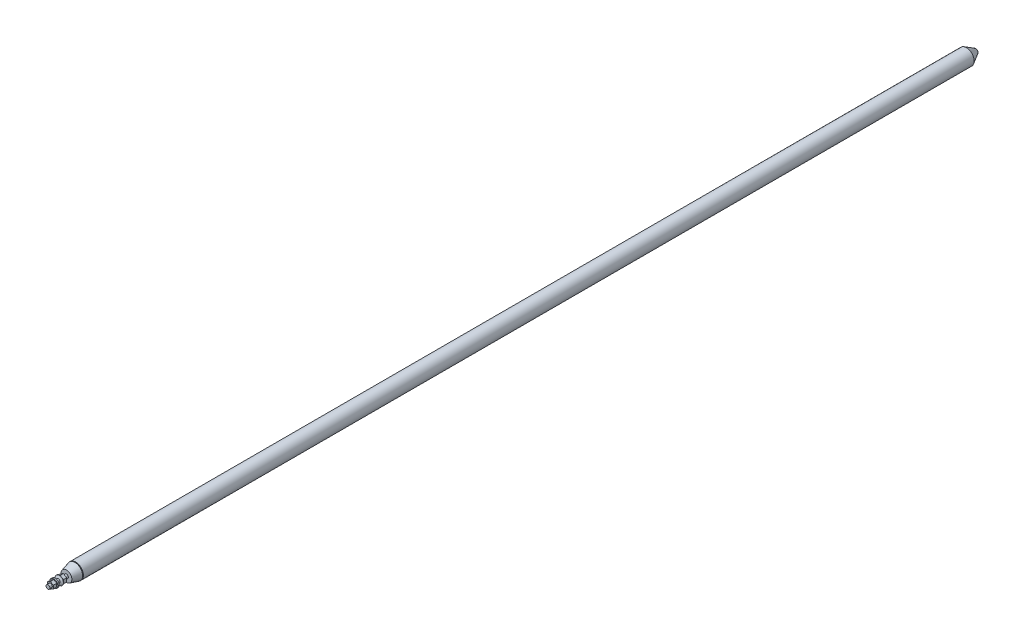
ISO-10303-21;
HEADER;
FILE_DESCRIPTION(('STEP AP214'),'2;1');
FILE_NAME('part.step','',(''),(''),'','','');
FILE_SCHEMA(('AUTOMOTIVE_DESIGN { 1 0 10303 214 1 1 1 1 }'));
ENDSEC;
DATA;
#1=APPLICATION_CONTEXT('core data for automotive mechanical design processes');
#2=APPLICATION_PROTOCOL_DEFINITION('international standard','automotive_design',2000,#1);
#3=PRODUCT_CONTEXT('',#1,'mechanical');
#4=PRODUCT('Part','Part','',(#3));
#5=PRODUCT_RELATED_PRODUCT_CATEGORY('part','',(#4));
#6=PRODUCT_DEFINITION_FORMATION('','',#4);
#7=PRODUCT_DEFINITION_CONTEXT('part definition',#1,'design');
#8=PRODUCT_DEFINITION('design','',#6,#7);
#9=PRODUCT_DEFINITION_SHAPE('','',#8);
#10=(LENGTH_UNIT() NAMED_UNIT(*) SI_UNIT(.MILLI.,.METRE.));
#11=(NAMED_UNIT(*) PLANE_ANGLE_UNIT() SI_UNIT($,.RADIAN.));
#12=(NAMED_UNIT(*) SI_UNIT($,.STERADIAN.) SOLID_ANGLE_UNIT());
#13=UNCERTAINTY_MEASURE_WITH_UNIT(LENGTH_MEASURE(1.E-05),#10,'distance_accuracy_value','');
#14=(GEOMETRIC_REPRESENTATION_CONTEXT(3) GLOBAL_UNCERTAINTY_ASSIGNED_CONTEXT((#13)) GLOBAL_UNIT_ASSIGNED_CONTEXT((#10,
#11,#12)) REPRESENTATION_CONTEXT('',''));
#15=CARTESIAN_POINT('',(0.,0.,0.));
#16=DIRECTION('',(0.,0.,1.));
#17=DIRECTION('',(1.,0.,0.));
#18=AXIS2_PLACEMENT_3D('',#15,#16,#17);
#19=CARTESIAN_POINT('',(0.,16.6751,52.1089983991226));
#20=DIRECTION('',(0.,0.,1.));
#21=DIRECTION('',(1.,0.,0.));
#22=AXIS2_PLACEMENT_3D('',#19,#20,#21);
#23=PLANE('',#22);
#24=CARTESIAN_POINT('',(0.,0.,52.1089983991226));
#25=DIRECTION('',(0.,0.,-1.));
#26=DIRECTION('',(-1.,0.,0.));
#27=AXIS2_PLACEMENT_3D('',#24,#25,#26);
#28=CIRCLE('',#27,16.6751);
#29=CARTESIAN_POINT('',(-16.6751,0.,52.1089983991226));
#30=VERTEX_POINT('',#29);
#31=EDGE_CURVE('E149',#30,#30,#28,.T.);
#32=ORIENTED_EDGE('',*,*,#31,.F.);
#33=EDGE_LOOP('',(#32));
#34=FACE_BOUND('',#33,.T.);
#35=DIRECTION('',(0.866025403784438,0.5,0.));
#36=VECTOR('',#35,1.);
#37=CARTESIAN_POINT('',(0.,-13.7554856334967,52.1089983991226));
#38=LINE('',#37,#36);
#39=CARTESIAN_POINT('',(0.,-13.7554856334967,52.1089983991226));
#40=VERTEX_POINT('',#39);
#41=CARTESIAN_POINT('',(11.9126,-6.87774281674833,52.1089983991226));
#42=VERTEX_POINT('',#41);
#43=EDGE_CURVE('E626',#40,#42,#38,.T.);
#44=ORIENTED_EDGE('',*,*,#43,.F.);
#45=DIRECTION('',(0.866025403784439,-0.499999999999999,0.));
#46=VECTOR('',#45,1.);
#47=CARTESIAN_POINT('',(-11.9126,-6.87774281674834,52.1089983991226));
#48=LINE('',#47,#46);
#49=CARTESIAN_POINT('',(-11.9126,-6.87774281674834,52.1089983991226));
#50=VERTEX_POINT('',#49);
#51=EDGE_CURVE('E147',#50,#40,#48,.T.);
#52=ORIENTED_EDGE('',*,*,#51,.F.);
#53=DIRECTION('',(0.,-1.,0.));
#54=VECTOR('',#53,1.);
#55=CARTESIAN_POINT('',(-11.9126,6.87774281674833,52.1089983991226));
#56=LINE('',#55,#54);
#57=CARTESIAN_POINT('',(-11.9126,6.87774281674833,52.1089983991226));
#58=VERTEX_POINT('',#57);
#59=EDGE_CURVE('E143',#58,#50,#56,.T.);
#60=ORIENTED_EDGE('',*,*,#59,.F.);
#61=DIRECTION('',(-0.866025403784439,-0.5,0.));
#62=VECTOR('',#61,1.);
#63=CARTESIAN_POINT('',(0.,13.7554856334967,52.1089983991226));
#64=LINE('',#63,#62);
#65=CARTESIAN_POINT('',(0.,13.7554856334967,52.1089983991226));
#66=VERTEX_POINT('',#65);
#67=EDGE_CURVE('E622',#66,#58,#64,.T.);
#68=ORIENTED_EDGE('',*,*,#67,.F.);
#69=DIRECTION('',(-0.866025403784439,0.5,0.));
#70=VECTOR('',#69,1.);
#71=CARTESIAN_POINT('',(11.9126,6.87774281674833,52.1089983991226));
#72=LINE('',#71,#70);
#73=CARTESIAN_POINT('',(11.9126,6.87774281674833,52.1089983991226));
#74=VERTEX_POINT('',#73);
#75=EDGE_CURVE('E634',#74,#66,#72,.T.);
#76=ORIENTED_EDGE('',*,*,#75,.F.);
#77=DIRECTION('',(0.,1.,0.));
#78=VECTOR('',#77,1.);
#79=CARTESIAN_POINT('',(11.9126,-6.87774281674833,52.1089983991226));
#80=LINE('',#79,#78);
#81=EDGE_CURVE('E628',#42,#74,#80,.T.);
#82=ORIENTED_EDGE('',*,*,#81,.F.);
#83=EDGE_LOOP('',(#44,#52,#60,#68,#76,#82));
#84=FACE_BOUND('',#83,.T.);
#85=ADVANCED_FACE('F33',(#34,#84),#23,.T.);
#86=CARTESIAN_POINT('',(0.,0.,0.));
#87=DIRECTION('',(0.,0.,-1.));
#88=DIRECTION('',(-1.,0.,0.));
#89=AXIS2_PLACEMENT_3D('',#86,#87,#88);
#90=CYLINDRICAL_SURFACE('',#89,7.93749999999999);
#91=CARTESIAN_POINT('',(0.,0.,46.2923983991226));
#92=DIRECTION('',(0.,0.,-1.));
#93=DIRECTION('',(-1.,0.,0.));
#94=AXIS2_PLACEMENT_3D('',#91,#92,#93);
#95=CIRCLE('',#94,7.93749999999999);
#96=CARTESIAN_POINT('',(-7.93749999999999,0.,46.2923983991226));
#97=VERTEX_POINT('',#96);
#98=EDGE_CURVE('E42',#97,#97,#95,.F.);
#99=ORIENTED_EDGE('',*,*,#98,.F.);
#100=EDGE_LOOP('',(#99));
#101=FACE_BOUND('',#100,.T.);
#102=CARTESIAN_POINT('',(0.,0.,33.5923983991226));
#103=DIRECTION('',(0.,0.,-1.));
#104=DIRECTION('',(-1.,0.,0.));
#105=AXIS2_PLACEMENT_3D('',#102,#103,#104);
#106=CIRCLE('',#105,7.93749999999999);
#107=CARTESIAN_POINT('',(0.,7.93749999999996,33.5923983991227));
#108=VERTEX_POINT('',#107);
#109=EDGE_CURVE('E236',#108,#108,#106,.T.);
#110=ORIENTED_EDGE('',*,*,#109,.F.);
#111=EDGE_LOOP('',(#110));
#112=FACE_BOUND('',#111,.T.);
#113=ADVANCED_FACE('F248',(#101,#112),#90,.T.);
#114=CARTESIAN_POINT('',(0.,0.,0.));
#115=DIRECTION('',(0.,0.,-1.));
#116=DIRECTION('',(-1.,0.,0.));
#117=AXIS2_PLACEMENT_3D('',#114,#115,#116);
#118=CIRCLE('',#117,7.93749999999999);
#119=CARTESIAN_POINT('',(-7.93749999999999,0.,0.));
#120=VERTEX_POINT('',#119);
#121=EDGE_CURVE('E224',#120,#120,#118,.T.);
#122=ORIENTED_EDGE('',*,*,#121,.F.);
#123=EDGE_LOOP('',(#122));
#124=FACE_BOUND('',#123,.T.);
#125=CARTESIAN_POINT('',(0.,0.,12.690475));
#126=DIRECTION('',(0.,0.,1.));
#127=DIRECTION('',(1.,0.,0.));
#128=AXIS2_PLACEMENT_3D('',#125,#126,#127);
#129=CIRCLE('',#128,7.93749999999999);
#130=CARTESIAN_POINT('',(7.93749999999999,0.,12.690475));
#131=VERTEX_POINT('',#130);
#132=EDGE_CURVE('E201',#131,#131,#129,.F.);
#133=ORIENTED_EDGE('',*,*,#132,.T.);
#134=EDGE_LOOP('',(#133));
#135=FACE_BOUND('',#134,.T.);
#136=ADVANCED_FACE('F251',(#124,#135),#90,.T.);
#137=CARTESIAN_POINT('',(0.,0.,-38.1));
#138=DIRECTION('',(0.,0.,1.));
#139=DIRECTION('',(1.,0.,0.));
#140=AXIS2_PLACEMENT_3D('',#137,#138,#139);
#141=CONICAL_SURFACE('',#140,28.575,0.780728808749583);
#142=CARTESIAN_POINT('',(0.,0.,-34.8952102827305));
#143=DIRECTION('',(0.,0.,-1.));
#144=DIRECTION('',(-1.,0.,0.));
#145=AXIS2_PLACEMENT_3D('',#142,#143,#144);
#146=CIRCLE('',#145,31.75);
#147=CARTESIAN_POINT('',(-31.75,0.,-34.8952102827305));
#148=VERTEX_POINT('',#147);
#149=EDGE_CURVE('E230',#148,#148,#146,.T.);
#150=ORIENTED_EDGE('',*,*,#149,.T.);
#151=EDGE_LOOP('',(#150));
#152=FACE_BOUND('',#151,.T.);
#153=CARTESIAN_POINT('',(0.,0.,-38.1));
#154=DIRECTION('',(0.,0.,-1.));
#155=DIRECTION('',(-1.,0.,0.));
#156=AXIS2_PLACEMENT_3D('',#153,#154,#155);
#157=CIRCLE('',#156,28.575);
#158=CARTESIAN_POINT('',(-28.575,0.,-38.1));
#159=VERTEX_POINT('',#158);
#160=EDGE_CURVE('E233',#159,#159,#157,.T.);
#161=ORIENTED_EDGE('',*,*,#160,.F.);
#162=EDGE_LOOP('',(#161));
#163=FACE_BOUND('',#162,.T.);
#164=ADVANCED_FACE('F454',(#152,#163),#141,.T.);
#165=CARTESIAN_POINT('',(0.,0.,-34.8952102827305));
#166=DIRECTION('',(0.,0.,-1.));
#167=DIRECTION('',(-1.,0.,0.));
#168=AXIS2_PLACEMENT_3D('',#165,#166,#167);
#169=CONICAL_SURFACE('',#168,31.75,0.266468742447018);
#170=CARTESIAN_POINT('',(0.,0.,0.));
#171=DIRECTION('',(0.,0.,-1.));
#172=DIRECTION('',(-1.,0.,0.));
#173=AXIS2_PLACEMENT_3D('',#170,#171,#172);
#174=CIRCLE('',#173,22.225);
#175=CARTESIAN_POINT('',(-22.225,0.,0.));
#176=VERTEX_POINT('',#175);
#177=EDGE_CURVE('E227',#176,#176,#174,.T.);
#178=ORIENTED_EDGE('',*,*,#177,.T.);
#179=EDGE_LOOP('',(#178));
#180=FACE_BOUND('',#179,.T.);
#181=ORIENTED_EDGE('',*,*,#149,.F.);
#182=EDGE_LOOP('',(#181));
#183=FACE_BOUND('',#182,.T.);
#184=ADVANCED_FACE('F540',(#180,#183),#169,.T.);
#185=CARTESIAN_POINT('',(0.,7.93749999999999,0.));
#186=DIRECTION('',(0.,0.,1.));
#187=DIRECTION('',(1.,0.,0.));
#188=AXIS2_PLACEMENT_3D('',#185,#186,#187);
#189=PLANE('',#188);
#190=ORIENTED_EDGE('',*,*,#121,.T.);
#191=EDGE_LOOP('',(#190));
#192=FACE_BOUND('',#191,.T.);
#193=ORIENTED_EDGE('',*,*,#177,.F.);
#194=EDGE_LOOP('',(#193));
#195=FACE_BOUND('',#194,.T.);
#196=ADVANCED_FACE('F527',(#192,#195),#189,.T.);
#197=CARTESIAN_POINT('',(0.,31.75,-38.1));
#198=DIRECTION('',(0.,0.,-1.));
#199=DIRECTION('',(-1.,0.,0.));
#200=AXIS2_PLACEMENT_3D('',#197,#198,#199);
#201=PLANE('',#200);
#202=ORIENTED_EDGE('',*,*,#160,.T.);
#203=EDGE_LOOP('',(#202));
#204=FACE_BOUND('',#203,.T.);
#205=CARTESIAN_POINT('',(0.,0.,-38.1));
#206=DIRECTION('',(0.,0.,1.));
#207=DIRECTION('',(1.,0.,0.));
#208=AXIS2_PLACEMENT_3D('',#205,#206,#207);
#209=CIRCLE('',#208,31.75);
#210=CARTESIAN_POINT('',(31.75,0.,-38.1));
#211=VERTEX_POINT('',#210);
#212=EDGE_CURVE('E205',#211,#211,#209,.T.);
#213=ORIENTED_EDGE('',*,*,#212,.T.);
#214=EDGE_LOOP('',(#213));
#215=FACE_BOUND('',#214,.T.);
#216=ADVANCED_FACE('F523',(#204,#215),#201,.F.);
#217=CARTESIAN_POINT('',(0.,0.,29.7434));
#218=DIRECTION('',(0.,0.,1.));
#219=DIRECTION('',(1.,0.,0.));
#220=AXIS2_PLACEMENT_3D('',#217,#218,#219);
#221=CYLINDRICAL_SURFACE('',#220,31.75);
#222=ORIENTED_EDGE('',*,*,#212,.F.);
#223=EDGE_LOOP('',(#222));
#224=FACE_BOUND('',#223,.T.);
#225=CARTESIAN_POINT('',(0.,0.,-3705.36426531401));
#226=DIRECTION('',(0.,0.,1.));
#227=DIRECTION('',(1.,0.,0.));
#228=AXIS2_PLACEMENT_3D('',#225,#226,#227);
#229=CIRCLE('',#228,31.75);
#230=CARTESIAN_POINT('',(31.75,0.,-3705.36426531401));
#231=VERTEX_POINT('',#230);
#232=EDGE_CURVE('E208',#231,#231,#229,.T.);
#233=ORIENTED_EDGE('',*,*,#232,.T.);
#234=EDGE_LOOP('',(#233));
#235=FACE_BOUND('',#234,.T.);
#236=ADVANCED_FACE('F526',(#224,#235),#221,.T.);
#237=CARTESIAN_POINT('',(0.,0.,-3741.30687845432));
#238=DIRECTION('',(0.,0.,1.));
#239=DIRECTION('',(1.,0.,0.));
#240=AXIS2_PLACEMENT_3D('',#237,#238,#239);
#241=CONICAL_SURFACE('',#240,10.9985226280624,0.523598775598293);
#242=ORIENTED_EDGE('',*,*,#232,.F.);
#243=EDGE_LOOP('',(#242));
#244=FACE_BOUND('',#243,.T.);
#245=CARTESIAN_POINT('',(0.,0.,-3741.30687845432));
#246=DIRECTION('',(0.,0.,1.));
#247=DIRECTION('',(1.,0.,0.));
#248=AXIS2_PLACEMENT_3D('',#245,#246,#247);
#249=CIRCLE('',#248,10.9985226280624);
#250=CARTESIAN_POINT('',(10.9985226280624,0.,-3741.30687845432));
#251=VERTEX_POINT('',#250);
#252=EDGE_CURVE('E211',#251,#251,#249,.T.);
#253=ORIENTED_EDGE('',*,*,#252,.T.);
#254=EDGE_LOOP('',(#253));
#255=FACE_BOUND('',#254,.T.);
#256=ADVANCED_FACE('F531',(#244,#255),#241,.T.);
#257=CARTESIAN_POINT('',(0.,0.,-3734.95687845432));
#258=DIRECTION('',(0.,0.,1.));
#259=DIRECTION('',(0.,1.,0.));
#260=AXIS2_PLACEMENT_3D('',#257,#258,#259);
#261=SPHERICAL_SURFACE('',#260,12.7000000000001);
#262=ORIENTED_EDGE('',*,*,#252,.F.);
#263=EDGE_LOOP('',(#262));
#264=FACE_BOUND('',#263,.T.);
#265=ADVANCED_FACE('F464',(#264),#261,.T.);
#266=CARTESIAN_POINT('',(13.5001,-7.79428636908687,12.690475));
#267=DIRECTION('',(-0.499999999999999,0.866025403784439,0.));
#268=DIRECTION('',(-0.866025403784439,-0.5,0.));
#269=AXIS2_PLACEMENT_3D('',#266,#267,#268);
#270=PLANE('',#269);
#271=DIRECTION('',(-0.866025403784439,-0.499999999999999,0.));
#272=VECTOR('',#271,1.);
#273=CARTESIAN_POINT('',(13.5001,-7.79428636908687,28.1686));
#274=LINE('',#273,#272);
#275=CARTESIAN_POINT('',(13.5001,-7.79428636908687,28.1686));
#276=VERTEX_POINT('',#275);
#277=CARTESIAN_POINT('',(0.,-15.5885727381737,28.1686));
#278=VERTEX_POINT('',#277);
#279=EDGE_CURVE('E160',#276,#278,#274,.T.);
#280=ORIENTED_EDGE('',*,*,#279,.T.);
#281=DIRECTION('',(0.,0.,1.));
#282=VECTOR('',#281,1.);
#283=CARTESIAN_POINT('',(0.,-15.5885727381737,12.690475));
#284=LINE('',#283,#282);
#285=CARTESIAN_POINT('',(0.,-15.5885727381737,12.690475));
#286=VERTEX_POINT('',#285);
#287=EDGE_CURVE('E199',#286,#278,#284,.T.);
#288=ORIENTED_EDGE('',*,*,#287,.F.);
#289=DIRECTION('',(-0.866025403784439,-0.499999999999999,0.));
#290=VECTOR('',#289,1.);
#291=CARTESIAN_POINT('',(13.5001,-7.79428636908687,12.690475));
#292=LINE('',#291,#290);
#293=CARTESIAN_POINT('',(13.5001,-7.79428636908687,12.690475));
#294=VERTEX_POINT('',#293);
#295=EDGE_CURVE('E161',#294,#286,#292,.T.);
#296=ORIENTED_EDGE('',*,*,#295,.F.);
#297=DIRECTION('',(0.,0.,1.));
#298=VECTOR('',#297,1.);
#299=CARTESIAN_POINT('',(13.5001,-7.79428636908687,12.690475));
#300=LINE('',#299,#298);
#301=EDGE_CURVE('E175',#294,#276,#300,.T.);
#302=ORIENTED_EDGE('',*,*,#301,.T.);
#303=EDGE_LOOP('',(#280,#288,#296,#302));
#304=FACE_BOUND('',#303,.T.);
#305=ADVANCED_FACE('F292',(#304),#270,.F.);
#306=CARTESIAN_POINT('',(0.,-15.5885727381737,12.690475));
#307=DIRECTION('',(0.5,0.866025403784438,0.));
#308=DIRECTION('',(-0.866025403784438,0.5,0.));
#309=AXIS2_PLACEMENT_3D('',#306,#307,#308);
#310=PLANE('',#309);
#311=DIRECTION('',(-0.866025403784438,0.5,0.));
#312=VECTOR('',#311,1.);
#313=CARTESIAN_POINT('',(0.,-15.5885727381737,28.1686));
#314=LINE('',#313,#312);
#315=CARTESIAN_POINT('',(-13.5001,-7.79428636908686,28.1686));
#316=VERTEX_POINT('',#315);
#317=EDGE_CURVE('E178',#278,#316,#314,.T.);
#318=ORIENTED_EDGE('',*,*,#317,.T.);
#319=DIRECTION('',(0.,0.,1.));
#320=VECTOR('',#319,1.);
#321=CARTESIAN_POINT('',(-13.5001,-7.79428636908686,12.690475));
#322=LINE('',#321,#320);
#323=CARTESIAN_POINT('',(-13.5001,-7.79428636908686,12.690475));
#324=VERTEX_POINT('',#323);
#325=EDGE_CURVE('E196',#324,#316,#322,.T.);
#326=ORIENTED_EDGE('',*,*,#325,.F.);
#327=DIRECTION('',(-0.866025403784438,0.5,0.));
#328=VECTOR('',#327,1.);
#329=CARTESIAN_POINT('',(0.,-15.5885727381737,12.690475));
#330=LINE('',#329,#328);
#331=EDGE_CURVE('E164',#286,#324,#330,.T.);
#332=ORIENTED_EDGE('',*,*,#331,.F.);
#333=ORIENTED_EDGE('',*,*,#287,.T.);
#334=EDGE_LOOP('',(#318,#326,#332,#333));
#335=FACE_BOUND('',#334,.T.);
#336=ADVANCED_FACE('F280',(#335),#310,.F.);
#337=CARTESIAN_POINT('',(-13.5001,-7.79428636908686,12.690475));
#338=DIRECTION('',(1.,0.,0.));
#339=DIRECTION('',(0.,1.,0.));
#340=AXIS2_PLACEMENT_3D('',#337,#338,#339);
#341=PLANE('',#340);
#342=DIRECTION('',(0.,1.,0.));
#343=VECTOR('',#342,1.);
#344=CARTESIAN_POINT('',(-13.5001,-7.79428636908686,28.1686));
#345=LINE('',#344,#343);
#346=CARTESIAN_POINT('',(-13.5001,7.79428636908686,28.1686));
#347=VERTEX_POINT('',#346);
#348=EDGE_CURVE('E180',#316,#347,#345,.T.);
#349=ORIENTED_EDGE('',*,*,#348,.T.);
#350=DIRECTION('',(0.,0.,1.));
#351=VECTOR('',#350,1.);
#352=CARTESIAN_POINT('',(-13.5001,7.79428636908686,12.690475));
#353=LINE('',#352,#351);
#354=CARTESIAN_POINT('',(-13.5001,7.79428636908686,12.690475));
#355=VERTEX_POINT('',#354);
#356=EDGE_CURVE('E193',#355,#347,#353,.T.);
#357=ORIENTED_EDGE('',*,*,#356,.F.);
#358=DIRECTION('',(0.,1.,0.));
#359=VECTOR('',#358,1.);
#360=CARTESIAN_POINT('',(-13.5001,-7.79428636908686,12.690475));
#361=LINE('',#360,#359);
#362=EDGE_CURVE('E167',#324,#355,#361,.T.);
#363=ORIENTED_EDGE('',*,*,#362,.F.);
#364=ORIENTED_EDGE('',*,*,#325,.T.);
#365=EDGE_LOOP('',(#349,#357,#363,#364));
#366=FACE_BOUND('',#365,.T.);
#367=ADVANCED_FACE('F284',(#366),#341,.F.);
#368=CARTESIAN_POINT('',(-13.5001,7.79428636908686,12.690475));
#369=DIRECTION('',(0.5,-0.866025403784439,0.));
#370=DIRECTION('',(0.866025403784439,0.5,0.));
#371=AXIS2_PLACEMENT_3D('',#368,#369,#370);
#372=PLANE('',#371);
#373=DIRECTION('',(0.866025403784439,0.5,0.));
#374=VECTOR('',#373,1.);
#375=CARTESIAN_POINT('',(-13.5001,7.79428636908686,28.1686));
#376=LINE('',#375,#374);
#377=CARTESIAN_POINT('',(0.,15.5885727381737,28.1686));
#378=VERTEX_POINT('',#377);
#379=EDGE_CURVE('E182',#347,#378,#376,.T.);
#380=ORIENTED_EDGE('',*,*,#379,.T.);
#381=DIRECTION('',(0.,0.,1.));
#382=VECTOR('',#381,1.);
#383=CARTESIAN_POINT('',(0.,15.5885727381737,12.690475));
#384=LINE('',#383,#382);
#385=CARTESIAN_POINT('',(0.,15.5885727381737,12.690475));
#386=VERTEX_POINT('',#385);
#387=EDGE_CURVE('E190',#386,#378,#384,.T.);
#388=ORIENTED_EDGE('',*,*,#387,.F.);
#389=DIRECTION('',(0.866025403784439,0.5,0.));
#390=VECTOR('',#389,1.);
#391=CARTESIAN_POINT('',(-13.5001,7.79428636908686,12.690475));
#392=LINE('',#391,#390);
#393=EDGE_CURVE('E169',#355,#386,#392,.T.);
#394=ORIENTED_EDGE('',*,*,#393,.F.);
#395=ORIENTED_EDGE('',*,*,#356,.T.);
#396=EDGE_LOOP('',(#380,#388,#394,#395));
#397=FACE_BOUND('',#396,.T.);
#398=ADVANCED_FACE('F299',(#397),#372,.F.);
#399=CARTESIAN_POINT('',(0.,15.5885727381737,12.690475));
#400=DIRECTION('',(-0.5,-0.866025403784438,0.));
#401=DIRECTION('',(0.866025403784439,-0.5,0.));
#402=AXIS2_PLACEMENT_3D('',#399,#400,#401);
#403=PLANE('',#402);
#404=DIRECTION('',(0.866025403784438,-0.5,0.));
#405=VECTOR('',#404,1.);
#406=CARTESIAN_POINT('',(0.,15.5885727381737,28.1686));
#407=LINE('',#406,#405);
#408=CARTESIAN_POINT('',(13.5001,7.79428636908686,28.1686));
#409=VERTEX_POINT('',#408);
#410=EDGE_CURVE('E184',#378,#409,#407,.T.);
#411=ORIENTED_EDGE('',*,*,#410,.T.);
#412=DIRECTION('',(0.,0.,1.));
#413=VECTOR('',#412,1.);
#414=CARTESIAN_POINT('',(13.5001,7.79428636908686,12.690475));
#415=LINE('',#414,#413);
#416=CARTESIAN_POINT('',(13.5001,7.79428636908686,12.690475));
#417=VERTEX_POINT('',#416);
#418=EDGE_CURVE('E57',#417,#409,#415,.T.);
#419=ORIENTED_EDGE('',*,*,#418,.F.);
#420=DIRECTION('',(0.866025403784438,-0.5,0.));
#421=VECTOR('',#420,1.);
#422=CARTESIAN_POINT('',(0.,15.5885727381737,12.690475));
#423=LINE('',#422,#421);
#424=EDGE_CURVE('E171',#386,#417,#423,.T.);
#425=ORIENTED_EDGE('',*,*,#424,.F.);
#426=ORIENTED_EDGE('',*,*,#387,.T.);
#427=EDGE_LOOP('',(#411,#419,#425,#426));
#428=FACE_BOUND('',#427,.T.);
#429=ADVANCED_FACE('F296',(#428),#403,.F.);
#430=CARTESIAN_POINT('',(13.5001,7.79428636908686,12.690475));
#431=DIRECTION('',(-1.,0.,0.));
#432=DIRECTION('',(0.,0.,1.));
#433=AXIS2_PLACEMENT_3D('',#430,#431,#432);
#434=PLANE('',#433);
#435=DIRECTION('',(0.,-1.,0.));
#436=VECTOR('',#435,1.);
#437=CARTESIAN_POINT('',(13.5001,7.79428636908686,28.1686));
#438=LINE('',#437,#436);
#439=EDGE_CURVE('E165',#409,#276,#438,.T.);
#440=ORIENTED_EDGE('',*,*,#439,.T.);
#441=ORIENTED_EDGE('',*,*,#301,.F.);
#442=DIRECTION('',(0.,-1.,0.));
#443=VECTOR('',#442,1.);
#444=CARTESIAN_POINT('',(13.5001,7.79428636908686,12.690475));
#445=LINE('',#444,#443);
#446=EDGE_CURVE('E173',#417,#294,#445,.T.);
#447=ORIENTED_EDGE('',*,*,#446,.F.);
#448=ORIENTED_EDGE('',*,*,#418,.T.);
#449=EDGE_LOOP('',(#440,#441,#447,#448));
#450=FACE_BOUND('',#449,.T.);
#451=ADVANCED_FACE('F293',(#450),#434,.F.);
#452=CARTESIAN_POINT('',(13.5001,-7.79428636908687,12.690475));
#453=DIRECTION('',(0.,0.,1.));
#454=DIRECTION('',(1.,0.,0.));
#455=AXIS2_PLACEMENT_3D('',#452,#453,#454);
#456=PLANE('',#455);
#457=ORIENTED_EDGE('',*,*,#132,.F.);
#458=EDGE_LOOP('',(#457));
#459=FACE_BOUND('',#458,.T.);
#460=ORIENTED_EDGE('',*,*,#295,.T.);
#461=ORIENTED_EDGE('',*,*,#331,.T.);
#462=ORIENTED_EDGE('',*,*,#362,.T.);
#463=ORIENTED_EDGE('',*,*,#393,.T.);
#464=ORIENTED_EDGE('',*,*,#424,.T.);
#465=ORIENTED_EDGE('',*,*,#446,.T.);
#466=EDGE_LOOP('',(#460,#461,#462,#463,#464,#465));
#467=FACE_BOUND('',#466,.T.);
#468=ADVANCED_FACE('F260',(#459,#467),#456,.F.);
#469=CARTESIAN_POINT('',(0.,0.,0.0435161764705885));
#470=DIRECTION('',(0.,0.,-1.));
#471=DIRECTION('',(0.,1.,0.));
#472=AXIS2_PLACEMENT_3D('',#469,#470,#471);
#473=SPHERICAL_SURFACE('',#472,34.4750838235294);
#474=CARTESIAN_POINT('',(0.,0.,29.7688));
#475=DIRECTION('',(0.,0.,-1.));
#476=DIRECTION('',(-1.,0.,0.));
#477=AXIS2_PLACEMENT_3D('',#474,#475,#476);
#478=CIRCLE('',#477,17.4625);
#479=CARTESIAN_POINT('',(0.,17.4625,29.7688));
#480=VERTEX_POINT('',#479);
#481=EDGE_CURVE('E215',#480,#480,#478,.T.);
#482=CARTESIAN_POINT('',(0.,7.93749999999996,33.5923983991227));
#483=CARTESIAN_POINT('',(0.,8.04193033230631,33.5676907138939));
#484=CARTESIAN_POINT('',(0.,8.14624529277318,33.5424953955937));
#485=CARTESIAN_POINT('',(0.,8.35463538983752,33.4911317569022));
#486=CARTESIAN_POINT('',(0.,8.458710526435,33.464963436511));
#487=CARTESIAN_POINT('',(0.,8.66661189557016,33.4116560576896));
#488=CARTESIAN_POINT('',(0.,8.77043812810784,33.3845169992594));
#489=CARTESIAN_POINT('',(0.,8.97783263624223,33.3292705157999));
#490=CARTESIAN_POINT('',(0.,9.08140091183892,33.3011630907704));
#491=CARTESIAN_POINT('',(0.,9.28827047420351,33.2439823239056));
#492=CARTESIAN_POINT('',(0.,9.39157176097139,33.2149089820701));
#493=CARTESIAN_POINT('',(0.,9.59789833747534,33.1557989172506));
#494=CARTESIAN_POINT('',(0.,9.7009236272114,33.1257621942665));
#495=CARTESIAN_POINT('',(0.,9.90668922540895,33.0647279863804));
#496=CARTESIAN_POINT('',(0.,10.0094295338704,33.0337305014784));
#497=CARTESIAN_POINT('',(0.,10.2146162101565,32.9707774728867));
#498=CARTESIAN_POINT('',(0.,10.3170625779811,32.938821929197));
#499=CARTESIAN_POINT('',(0.,10.521652439256,32.8739555696753));
#500=CARTESIAN_POINT('',(0.,10.6237959327063,32.8410447538433));
#501=CARTESIAN_POINT('',(0.,10.8277711379095,32.7742707199945));
#502=CARTESIAN_POINT('',(0.,10.9296028496623,32.7404075019776));
#503=CARTESIAN_POINT('',(0.,11.132945611335,32.6717316167674));
#504=CARTESIAN_POINT('',(0.,11.234456661255,32.636918949574));
#505=CARTESIAN_POINT('',(0.,11.4371492470899,32.5663472018157));
#506=CARTESIAN_POINT('',(0.,11.5383307830049,32.5305881212508));
#507=CARTESIAN_POINT('',(0.,11.7403555173927,32.458126665085));
#508=CARTESIAN_POINT('',(0.,11.8411987158655,32.4214242894841));
#509=CARTESIAN_POINT('',(0.,12.042537981436,32.3470794438415));
#510=CARTESIAN_POINT('',(0.,12.1430340485337,32.3094369737997));
#511=CARTESIAN_POINT('',(0.,12.3436702876927,32.2332152218499));
#512=CARTESIAN_POINT('',(0.,12.4438104597538,32.194635939942));
#513=CARTESIAN_POINT('',(0.,12.6437261762134,32.1165439285288));
#514=CARTESIAN_POINT('',(0.,12.7435017206118,32.0770311990235));
#515=CARTESIAN_POINT('',(0.,12.9426794809169,31.9970757380846));
#516=CARTESIAN_POINT('',(0.,13.0420816968236,31.956633006651));
#517=CARTESIAN_POINT('',(0.,13.2405041318717,31.8748210686243));
#518=CARTESIAN_POINT('',(0.,13.3395243510132,31.8334518620313));
#519=CARTESIAN_POINT('',(0.,13.5371741575694,31.7497905812473));
#520=CARTESIAN_POINT('',(0.,13.6358037449841,31.7074985070563));
#521=CARTESIAN_POINT('',(0.,13.8326636871895,31.6219951791153));
#522=CARTESIAN_POINT('',(0.,13.9308940419803,31.5787839253653));
#523=CARTESIAN_POINT('',(0.,14.1269469528556,31.4914460065018));
#524=CARTESIAN_POINT('',(0.,14.2247695089402,31.4473193413882));
#525=CARTESIAN_POINT('',(0.,14.4199982918825,31.3581544478201));
#526=CARTESIAN_POINT('',(0.,14.5174045187402,31.3131162193657));
#527=CARTESIAN_POINT('',(0.,14.7117921490136,31.2221321266308));
#528=CARTESIAN_POINT('',(0.,14.8087735524293,31.1761862623503));
#529=CARTESIAN_POINT('',(0.,15.0023030786502,31.0833909046278));
#530=CARTESIAN_POINT('',(0.,15.0988512014553,31.0365414111859));
#531=CARTESIAN_POINT('',(0.,15.2915057470694,30.9419428806036));
#532=CARTESIAN_POINT('',(0.,15.3876121698782,30.8941938434631));
#533=CARTESIAN_POINT('',(0.,15.579374934636,30.7978003893978));
#534=CARTESIAN_POINT('',(0.,15.675031276585,30.749155972473));
#535=CARTESIAN_POINT('',(0.,15.8658855379922,30.6509760008058));
#536=CARTESIAN_POINT('',(0.,15.9610834574505,30.6014404460634));
#537=CARTESIAN_POINT('',(0.,16.1510125722821,30.5014825185434));
#538=CARTESIAN_POINT('',(0.,16.2457437676554,30.4510601457658));
#539=CARTESIAN_POINT('',(0.,16.4347311731984,30.3493329789012));
#540=CARTESIAN_POINT('',(0.,16.5289873833681,30.2980281848143));
#541=CARTESIAN_POINT('',(0.,16.7170165996438,30.194540650465));
#542=CARTESIAN_POINT('',(0.,16.8107896057498,30.1423579102026));
#543=CARTESIAN_POINT('',(0.,16.9978442340481,30.0371190297578));
#544=CARTESIAN_POINT('',(0.,17.0911258562404,29.9840628895754));
#545=CARTESIAN_POINT('',(0.,17.2771895913833,29.877081852009));
#546=CARTESIAN_POINT('',(0.,17.369971704334,29.8231569546252));
#547=CARTESIAN_POINT('',(0.,17.4625,29.7688));
#548=B_SPLINE_CURVE_WITH_KNOTS('',3,(#482,#483,#484,#485,#486,#487,#488,#489,#490,#491,#492,
#493,#494,#495,#496,#497,#498,#499,#500,#501,#502,#503,#504,#505,#506,#507,#508,#509,#510,#511,
#512,#513,#514,#515,#516,#517,#518,#519,#520,#521,#522,#523,#524,#525,#526,#527,#528,#529,#530,
#531,#532,#533,#534,#535,#536,#537,#538,#539,#540,#541,#542,#543,#544,#545,#546,#547),
.UNSPECIFIED.,.F.,.F.,(4,2,2,2,2,2,2,2,2,2,2,2,2,2,2,2,2,2,2,2,2,2,2,2,2,2,2,2,2,2,2,2,4),(0.,
0.321939004572816,0.643878009145632,0.965817013718447,1.28775601829126,1.60969502286408,
1.9316340274369,2.25357303200971,2.57551203658253,2.89745104115534,3.21939004572815,
3.54132905030097,3.86326805487378,4.1852070594466,4.50714606401941,4.82908506859223,
5.15102407316505,5.47296307773786,5.79490208231068,6.11684108688349,6.43878009145631,
6.76071909602913,7.08265810060194,7.40459710517475,7.72653610974757,8.04847511432038,
8.3704141188932,8.69235312346602,9.01429212803883,9.33623113261165,9.65817013718446,
9.98010914175728,10.3020481463301),.UNSPECIFIED.);
#549=EDGE_CURVE('BSEAM256',#108,#480,#548,.T.);
#550=ORIENTED_EDGE('',*,*,#109,.T.);
#551=ORIENTED_EDGE('',*,*,#481,.F.);
#552=ORIENTED_EDGE('',*,*,#549,.T.);
#553=ORIENTED_EDGE('',*,*,#549,.F.);
#554=EDGE_LOOP('',(#550,#552,#551,#553));
#555=FACE_BOUND('',#554,.T.);
#556=ADVANCED_FACE('F256',(#555),#473,.T.);
#557=CARTESIAN_POINT('',(0.,0.,0.));
#558=DIRECTION('',(0.,0.,-1.));
#559=DIRECTION('',(-1.,0.,0.));
#560=AXIS2_PLACEMENT_3D('',#557,#558,#559);
#561=CYLINDRICAL_SURFACE('',#560,17.4625);
#562=ORIENTED_EDGE('',*,*,#481,.T.);
#563=EDGE_LOOP('',(#562));
#564=FACE_BOUND('',#563,.T.);
#565=CARTESIAN_POINT('',(0.,0.,28.1686));
#566=DIRECTION('',(0.,0.,-1.));
#567=DIRECTION('',(-1.,0.,0.));
#568=AXIS2_PLACEMENT_3D('',#565,#566,#567);
#569=CIRCLE('',#568,17.4625);
#570=CARTESIAN_POINT('',(-17.4625,0.,28.1686));
#571=VERTEX_POINT('',#570);
#572=EDGE_CURVE('E218',#571,#571,#569,.T.);
#573=ORIENTED_EDGE('',*,*,#572,.F.);
#574=EDGE_LOOP('',(#573));
#575=FACE_BOUND('',#574,.T.);
#576=ADVANCED_FACE('F259',(#564,#575),#561,.T.);
#577=CARTESIAN_POINT('',(0.,0.,28.1686));
#578=DIRECTION('',(0.,0.,-1.));
#579=DIRECTION('',(-1.,0.,0.));
#580=AXIS2_PLACEMENT_3D('',#577,#578,#579);
#581=PLANE('',#580);
#582=ORIENTED_EDGE('',*,*,#572,.T.);
#583=EDGE_LOOP('',(#582));
#584=FACE_BOUND('',#583,.T.);
#585=ORIENTED_EDGE('',*,*,#317,.F.);
#586=ORIENTED_EDGE('',*,*,#279,.F.);
#587=ORIENTED_EDGE('',*,*,#439,.F.);
#588=ORIENTED_EDGE('',*,*,#410,.F.);
#589=ORIENTED_EDGE('',*,*,#379,.F.);
#590=ORIENTED_EDGE('',*,*,#348,.F.);
#591=EDGE_LOOP('',(#585,#586,#587,#588,#589,#590));
#592=FACE_BOUND('',#591,.T.);
#593=ADVANCED_FACE('F266',(#584,#592),#581,.T.);
#594=CARTESIAN_POINT('',(0.,0.,46.2923983991226));
#595=DIRECTION('',(0.,0.,-1.));
#596=DIRECTION('',(-1.,0.,0.));
#597=AXIS2_PLACEMENT_3D('',#594,#595,#596);
#598=PLANE('',#597);
#599=ORIENTED_EDGE('',*,*,#98,.T.);
#600=EDGE_LOOP('',(#599));
#601=FACE_BOUND('',#600,.T.);
#602=CARTESIAN_POINT('',(0.,0.,46.2923983991226));
#603=DIRECTION('',(0.,0.,-1.));
#604=DIRECTION('',(-1.,0.,0.));
#605=AXIS2_PLACEMENT_3D('',#602,#603,#604);
#606=CIRCLE('',#605,16.6751);
#607=CARTESIAN_POINT('',(-16.6751,0.,46.2923983991226));
#608=VERTEX_POINT('',#607);
#609=EDGE_CURVE('E152',#608,#608,#606,.T.);
#610=ORIENTED_EDGE('',*,*,#609,.T.);
#611=EDGE_LOOP('',(#610));
#612=FACE_BOUND('',#611,.T.);
#613=ADVANCED_FACE('F245',(#601,#612),#598,.T.);
#614=CARTESIAN_POINT('',(0.,0.,0.));
#615=DIRECTION('',(0.,0.,-1.));
#616=DIRECTION('',(-1.,0.,0.));
#617=AXIS2_PLACEMENT_3D('',#614,#615,#616);
#618=CYLINDRICAL_SURFACE('',#617,16.6751);
#619=ORIENTED_EDGE('',*,*,#31,.T.);
#620=EDGE_LOOP('',(#619));
#621=FACE_BOUND('',#620,.T.);
#622=ORIENTED_EDGE('',*,*,#609,.F.);
#623=EDGE_LOOP('',(#622));
#624=FACE_BOUND('',#623,.T.);
#625=ADVANCED_FACE('F318',(#621,#624),#618,.T.);
#626=CARTESIAN_POINT('',(-11.9126,-6.87774281674834,65.9996233991226));
#627=DIRECTION('',(0.499999999999999,0.866025403784439,0.));
#628=DIRECTION('',(-0.866025403784439,0.499999999999999,0.));
#629=AXIS2_PLACEMENT_3D('',#626,#627,#628);
#630=PLANE('',#629);
#631=ORIENTED_EDGE('',*,*,#51,.T.);
#632=DIRECTION('',(0.,0.,-1.));
#633=VECTOR('',#632,1.);
#634=CARTESIAN_POINT('',(0.,-13.7554856334967,65.9996233991226));
#635=LINE('',#634,#633);
#636=CARTESIAN_POINT('',(0.,-13.7554856334967,65.9996233991226));
#637=VERTEX_POINT('',#636);
#638=EDGE_CURVE('E128',#637,#40,#635,.T.);
#639=ORIENTED_EDGE('',*,*,#638,.F.);
#640=DIRECTION('',(0.866025403784439,-0.499999999999999,0.));
#641=VECTOR('',#640,1.);
#642=CARTESIAN_POINT('',(-11.9126,-6.87774281674834,65.9996233991226));
#643=LINE('',#642,#641);
#644=CARTESIAN_POINT('',(-11.9126,-6.87774281674834,65.9996233991226));
#645=VERTEX_POINT('',#644);
#646=EDGE_CURVE('E135',#645,#637,#643,.T.);
#647=ORIENTED_EDGE('',*,*,#646,.F.);
#648=DIRECTION('',(0.,0.,-1.));
#649=VECTOR('',#648,1.);
#650=CARTESIAN_POINT('',(-11.9126,-6.87774281674834,65.9996233991226));
#651=LINE('',#650,#649);
#652=EDGE_CURVE('E620',#645,#50,#651,.T.);
#653=ORIENTED_EDGE('',*,*,#652,.T.);
#654=EDGE_LOOP('',(#631,#639,#647,#653));
#655=FACE_BOUND('',#654,.T.);
#656=ADVANCED_FACE('F145',(#655),#630,.F.);
#657=CARTESIAN_POINT('',(0.,-13.7554856334967,65.9996233991226));
#658=DIRECTION('',(-0.5,0.866025403784438,0.));
#659=DIRECTION('',(-0.866025403784438,-0.5,0.));
#660=AXIS2_PLACEMENT_3D('',#657,#658,#659);
#661=PLANE('',#660);
#662=ORIENTED_EDGE('',*,*,#43,.T.);
#663=DIRECTION('',(0.,0.,-1.));
#664=VECTOR('',#663,1.);
#665=CARTESIAN_POINT('',(11.9126,-6.87774281674833,65.9996233991226));
#666=LINE('',#665,#664);
#667=CARTESIAN_POINT('',(11.9126,-6.87774281674833,65.9996233991226));
#668=VERTEX_POINT('',#667);
#669=EDGE_CURVE('E131',#668,#42,#666,.T.);
#670=ORIENTED_EDGE('',*,*,#669,.F.);
#671=DIRECTION('',(0.866025403784438,0.5,0.));
#672=VECTOR('',#671,1.);
#673=CARTESIAN_POINT('',(0.,-13.7554856334967,65.9996233991226));
#674=LINE('',#673,#672);
#675=EDGE_CURVE('E124',#637,#668,#674,.T.);
#676=ORIENTED_EDGE('',*,*,#675,.F.);
#677=ORIENTED_EDGE('',*,*,#638,.T.);
#678=EDGE_LOOP('',(#662,#670,#676,#677));
#679=FACE_BOUND('',#678,.T.);
#680=ADVANCED_FACE('F126',(#679),#661,.F.);
#681=CARTESIAN_POINT('',(11.9126,-6.87774281674833,65.9996233991226));
#682=DIRECTION('',(-1.,0.,0.));
#683=DIRECTION('',(0.,-1.,0.));
#684=AXIS2_PLACEMENT_3D('',#681,#682,#683);
#685=PLANE('',#684);
#686=ORIENTED_EDGE('',*,*,#81,.T.);
#687=DIRECTION('',(0.,0.,-1.));
#688=VECTOR('',#687,1.);
#689=CARTESIAN_POINT('',(11.9126,6.87774281674833,65.9996233991226));
#690=LINE('',#689,#688);
#691=CARTESIAN_POINT('',(11.9126,6.87774281674833,65.9996233991226));
#692=VERTEX_POINT('',#691);
#693=EDGE_CURVE('E154',#692,#74,#690,.T.);
#694=ORIENTED_EDGE('',*,*,#693,.F.);
#695=DIRECTION('',(0.,1.,0.));
#696=VECTOR('',#695,1.);
#697=CARTESIAN_POINT('',(11.9126,-6.87774281674833,65.9996233991226));
#698=LINE('',#697,#696);
#699=EDGE_CURVE('E134',#668,#692,#698,.T.);
#700=ORIENTED_EDGE('',*,*,#699,.F.);
#701=ORIENTED_EDGE('',*,*,#669,.T.);
#702=EDGE_LOOP('',(#686,#694,#700,#701));
#703=FACE_BOUND('',#702,.T.);
#704=ADVANCED_FACE('F370',(#703),#685,.F.);
#705=CARTESIAN_POINT('',(11.9126,6.87774281674833,65.9996233991226));
#706=DIRECTION('',(-0.5,-0.866025403784439,0.));
#707=DIRECTION('',(0.866025403784439,-0.5,0.));
#708=AXIS2_PLACEMENT_3D('',#705,#706,#707);
#709=PLANE('',#708);
#710=ORIENTED_EDGE('',*,*,#75,.T.);
#711=DIRECTION('',(0.,0.,-1.));
#712=VECTOR('',#711,1.);
#713=CARTESIAN_POINT('',(0.,13.7554856334967,65.9996233991226));
#714=LINE('',#713,#712);
#715=CARTESIAN_POINT('',(0.,13.7554856334967,65.9996233991226));
#716=VERTEX_POINT('',#715);
#717=EDGE_CURVE('E638',#716,#66,#714,.T.);
#718=ORIENTED_EDGE('',*,*,#717,.F.);
#719=DIRECTION('',(-0.866025403784439,0.5,0.));
#720=VECTOR('',#719,1.);
#721=CARTESIAN_POINT('',(11.9126,6.87774281674833,65.9996233991226));
#722=LINE('',#721,#720);
#723=EDGE_CURVE('E645',#692,#716,#722,.T.);
#724=ORIENTED_EDGE('',*,*,#723,.F.);
#725=ORIENTED_EDGE('',*,*,#693,.T.);
#726=EDGE_LOOP('',(#710,#718,#724,#725));
#727=FACE_BOUND('',#726,.T.);
#728=ADVANCED_FACE('F376',(#727),#709,.F.);
#729=CARTESIAN_POINT('',(0.,13.7554856334967,65.9996233991226));
#730=DIRECTION('',(0.5,-0.866025403784439,0.));
#731=DIRECTION('',(0.866025403784439,0.5,0.));
#732=AXIS2_PLACEMENT_3D('',#729,#730,#731);
#733=PLANE('',#732);
#734=ORIENTED_EDGE('',*,*,#67,.T.);
#735=DIRECTION('',(0.,0.,-1.));
#736=VECTOR('',#735,1.);
#737=CARTESIAN_POINT('',(-11.9126,6.87774281674833,65.9996233991226));
#738=LINE('',#737,#736);
#739=CARTESIAN_POINT('',(-11.9126,6.87774281674833,65.9996233991226));
#740=VERTEX_POINT('',#739);
#741=EDGE_CURVE('E49',#740,#58,#738,.T.);
#742=ORIENTED_EDGE('',*,*,#741,.F.);
#743=DIRECTION('',(-0.866025403784439,-0.5,0.));
#744=VECTOR('',#743,1.);
#745=CARTESIAN_POINT('',(0.,13.7554856334967,65.9996233991226));
#746=LINE('',#745,#744);
#747=EDGE_CURVE('E647',#716,#740,#746,.T.);
#748=ORIENTED_EDGE('',*,*,#747,.F.);
#749=ORIENTED_EDGE('',*,*,#717,.T.);
#750=EDGE_LOOP('',(#734,#742,#748,#749));
#751=FACE_BOUND('',#750,.T.);
#752=ADVANCED_FACE('F384',(#751),#733,.F.);
#753=CARTESIAN_POINT('',(-11.9126,6.87774281674833,65.9996233991226));
#754=DIRECTION('',(1.,0.,0.));
#755=DIRECTION('',(0.,1.,0.));
#756=AXIS2_PLACEMENT_3D('',#753,#754,#755);
#757=PLANE('',#756);
#758=ORIENTED_EDGE('',*,*,#59,.T.);
#759=ORIENTED_EDGE('',*,*,#652,.F.);
#760=DIRECTION('',(0.,-1.,0.));
#761=VECTOR('',#760,1.);
#762=CARTESIAN_POINT('',(-11.9126,6.87774281674833,65.9996233991226));
#763=LINE('',#762,#761);
#764=EDGE_CURVE('E139',#740,#645,#763,.T.);
#765=ORIENTED_EDGE('',*,*,#764,.F.);
#766=ORIENTED_EDGE('',*,*,#741,.T.);
#767=EDGE_LOOP('',(#758,#759,#765,#766));
#768=FACE_BOUND('',#767,.T.);
#769=ADVANCED_FACE('F392',(#768),#757,.F.);
#770=CARTESIAN_POINT('',(11.9126,-20.633228450245,65.9996233991226));
#771=DIRECTION('',(0.,0.,1.));
#772=DIRECTION('',(1.,0.,0.));
#773=AXIS2_PLACEMENT_3D('',#770,#771,#772);
#774=PLANE('',#773);
#775=CARTESIAN_POINT('',(0.,0.,65.9996233991226));
#776=DIRECTION('',(0.,0.,1.));
#777=DIRECTION('',(1.,0.,0.));
#778=AXIS2_PLACEMENT_3D('',#775,#776,#777);
#779=CIRCLE('',#778,7.93749999999999);
#780=CARTESIAN_POINT('',(7.93749999999999,0.,65.9996233991226));
#781=VERTEX_POINT('',#780);
#782=EDGE_CURVE('E11',#781,#781,#779,.F.);
#783=ORIENTED_EDGE('',*,*,#782,.T.);
#784=EDGE_LOOP('',(#783));
#785=FACE_BOUND('',#784,.T.);
#786=ORIENTED_EDGE('',*,*,#646,.T.);
#787=ORIENTED_EDGE('',*,*,#675,.T.);
#788=ORIENTED_EDGE('',*,*,#699,.T.);
#789=ORIENTED_EDGE('',*,*,#723,.T.);
#790=ORIENTED_EDGE('',*,*,#747,.T.);
#791=ORIENTED_EDGE('',*,*,#764,.T.);
#792=EDGE_LOOP('',(#786,#787,#788,#789,#790,#791));
#793=FACE_BOUND('',#792,.T.);
#794=ADVANCED_FACE('F138',(#785,#793),#774,.T.);
#795=CARTESIAN_POINT('',(0.,0.,76.2));
#796=DIRECTION('',(0.,0.,1.));
#797=DIRECTION('',(1.,0.,0.));
#798=AXIS2_PLACEMENT_3D('',#795,#796,#797);
#799=PLANE('',#798);
#800=CARTESIAN_POINT('',(0.,0.,76.2));
#801=DIRECTION('',(0.,0.,-1.));
#802=DIRECTION('',(-1.,0.,0.));
#803=AXIS2_PLACEMENT_3D('',#800,#801,#802);
#804=CIRCLE('',#803,7.93749999999999);
#805=CARTESIAN_POINT('',(-7.93749999999999,0.,76.2));
#806=VERTEX_POINT('',#805);
#807=EDGE_CURVE('E221',#806,#806,#804,.T.);
#808=ORIENTED_EDGE('',*,*,#807,.F.);
#809=EDGE_LOOP('',(#808));
#810=FACE_BOUND('',#809,.T.);
#811=ADVANCED_FACE('F406',(#810),#799,.T.);
#812=ORIENTED_EDGE('',*,*,#782,.F.);
#813=EDGE_LOOP('',(#812));
#814=FACE_BOUND('',#813,.T.);
#815=ORIENTED_EDGE('',*,*,#807,.T.);
#816=EDGE_LOOP('',(#815));
#817=FACE_BOUND('',#816,.T.);
#818=ADVANCED_FACE('F253',(#814,#817),#90,.T.);
#819=CLOSED_SHELL('',(#85,#113,#136,#164,#184,#196,#216,#236,#256,#265,#305,#336,#367,#398,#429,
#451,#468,#556,#576,#593,#613,#625,#656,#680,#704,#728,#752,#769,#794,#811,#818));
#820=CARTESIAN_POINT('',(0.,28.575,-47.625));
#821=DIRECTION('',(0.,0.,-1.));
#822=DIRECTION('',(-1.,0.,0.));
#823=AXIS2_PLACEMENT_3D('',#820,#821,#822);
#824=PLANE('',#823);
#825=CARTESIAN_POINT('',(0.,0.,-47.625));
#826=DIRECTION('',(0.,0.,-1.));
#827=DIRECTION('',(-1.,0.,0.));
#828=AXIS2_PLACEMENT_3D('',#825,#826,#827);
#829=CIRCLE('',#828,28.5623);
#830=CARTESIAN_POINT('',(-28.5623,0.,-47.625));
#831=VERTEX_POINT('',#830);
#832=EDGE_CURVE('E214',#831,#831,#829,.T.);
#833=ORIENTED_EDGE('',*,*,#832,.T.);
#834=EDGE_LOOP('',(#833));
#835=FACE_BOUND('',#834,.T.);
#836=ADVANCED_FACE('F35',(#835),#824,.T.);
#837=CARTESIAN_POINT('',(0.,0.,29.7434));
#838=DIRECTION('',(0.,0.,1.));
#839=DIRECTION('',(1.,0.,0.));
#840=AXIS2_PLACEMENT_3D('',#837,#838,#839);
#841=CYLINDRICAL_SURFACE('',#840,28.5623);
#842=ORIENTED_EDGE('',*,*,#832,.F.);
#843=EDGE_LOOP('',(#842));
#844=FACE_BOUND('',#843,.T.);
#845=CARTESIAN_POINT('',(0.,0.,-3705.36426531401));
#846=DIRECTION('',(0.,0.,1.));
#847=DIRECTION('',(1.,0.,0.));
#848=AXIS2_PLACEMENT_3D('',#845,#846,#847);
#849=CIRCLE('',#848,28.5623);
#850=CARTESIAN_POINT('',(28.5623,0.,-3705.36426531401));
#851=VERTEX_POINT('',#850);
#852=EDGE_CURVE('E202',#851,#851,#849,.T.);
#853=ORIENTED_EDGE('',*,*,#852,.F.);
#854=EDGE_LOOP('',(#853));
#855=FACE_BOUND('',#854,.T.);
#856=ADVANCED_FACE('F427',(#844,#855),#841,.F.);
#857=CARTESIAN_POINT('',(0.,28.5623,-3705.36426531401));
#858=DIRECTION('',(0.,0.,-1.));
#859=DIRECTION('',(-1.,0.,0.));
#860=AXIS2_PLACEMENT_3D('',#857,#858,#859);
#861=PLANE('',#860);
#862=ORIENTED_EDGE('',*,*,#852,.T.);
#863=EDGE_LOOP('',(#862));
#864=FACE_BOUND('',#863,.T.);
#865=ADVANCED_FACE('F436',(#864),#861,.F.);
#866=CLOSED_SHELL('',(#836,#856,#865));
#867=ORIENTED_CLOSED_SHELL('',*,#866,.T.);
#868=BREP_WITH_VOIDS('B2',#819,(#867));
#869=ADVANCED_BREP_SHAPE_REPRESENTATION('',(#18,#868),#14);
#870=SHAPE_DEFINITION_REPRESENTATION(#9,#869);
ENDSEC;
END-ISO-10303-21;
